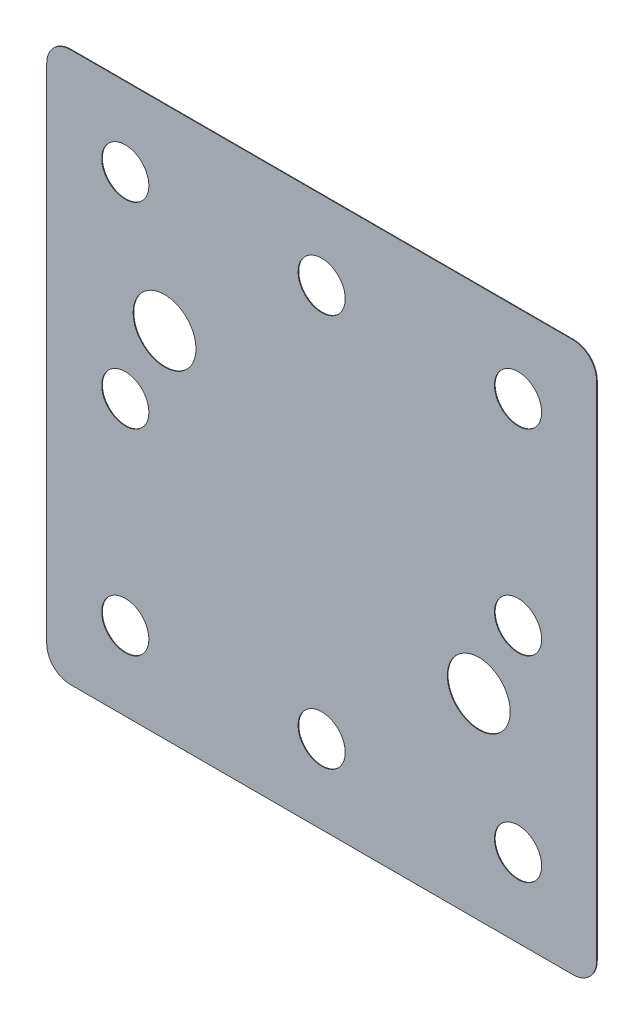
ISO-10303-21;
HEADER;
FILE_DESCRIPTION(('STEP AP214'),'2;1');
FILE_NAME('part.step','',(''),(''),'','','');
FILE_SCHEMA(('AUTOMOTIVE_DESIGN { 1 0 10303 214 1 1 1 1 }'));
ENDSEC;
DATA;
#1=APPLICATION_CONTEXT('core data for automotive mechanical design processes');
#2=APPLICATION_PROTOCOL_DEFINITION('international standard','automotive_design',2000,#1);
#3=PRODUCT_CONTEXT('',#1,'mechanical');
#4=PRODUCT('Part','Part','',(#3));
#5=PRODUCT_RELATED_PRODUCT_CATEGORY('part','',(#4));
#6=PRODUCT_DEFINITION_FORMATION('','',#4);
#7=PRODUCT_DEFINITION_CONTEXT('part definition',#1,'design');
#8=PRODUCT_DEFINITION('design','',#6,#7);
#9=PRODUCT_DEFINITION_SHAPE('','',#8);
#10=(LENGTH_UNIT() NAMED_UNIT(*) SI_UNIT(.MILLI.,.METRE.));
#11=(NAMED_UNIT(*) PLANE_ANGLE_UNIT() SI_UNIT($,.RADIAN.));
#12=(NAMED_UNIT(*) SI_UNIT($,.STERADIAN.) SOLID_ANGLE_UNIT());
#13=UNCERTAINTY_MEASURE_WITH_UNIT(LENGTH_MEASURE(1.E-05),#10,'distance_accuracy_value','');
#14=(GEOMETRIC_REPRESENTATION_CONTEXT(3) GLOBAL_UNCERTAINTY_ASSIGNED_CONTEXT((#13)) GLOBAL_UNIT_ASSIGNED_CONTEXT((#10,
#11,#12)) REPRESENTATION_CONTEXT('',''));
#15=CARTESIAN_POINT('',(0.,0.,0.));
#16=DIRECTION('',(0.,0.,1.));
#17=DIRECTION('',(1.,0.,0.));
#18=AXIS2_PLACEMENT_3D('',#15,#16,#17);
#19=CARTESIAN_POINT('',(35.,-35.,0.08));
#20=DIRECTION('',(-1.,0.,0.));
#21=DIRECTION('',(0.,0.,1.));
#22=AXIS2_PLACEMENT_3D('',#19,#20,#21);
#23=PLANE('',#22);
#24=DIRECTION('',(0.,1.,0.));
#25=VECTOR('',#24,1.);
#26=CARTESIAN_POINT('',(35.,-35.,0.08));
#27=LINE('',#26,#25);
#28=CARTESIAN_POINT('',(35.,-32.,0.08));
#29=VERTEX_POINT('',#28);
#30=CARTESIAN_POINT('',(35.,32.,0.08));
#31=VERTEX_POINT('',#30);
#32=EDGE_CURVE('E125',#29,#31,#27,.T.);
#33=ORIENTED_EDGE('',*,*,#32,.F.);
#34=DIRECTION('',(0.,0.,-1.));
#35=VECTOR('',#34,1.);
#36=CARTESIAN_POINT('',(35.,-32.,0.08));
#37=LINE('',#36,#35);
#38=CARTESIAN_POINT('',(35.,-32.,0.));
#39=VERTEX_POINT('',#38);
#40=EDGE_CURVE('E177',#29,#39,#37,.T.);
#41=ORIENTED_EDGE('',*,*,#40,.T.);
#42=DIRECTION('',(0.,1.,0.));
#43=VECTOR('',#42,1.);
#44=CARTESIAN_POINT('',(35.,-35.,0.));
#45=LINE('',#44,#43);
#46=CARTESIAN_POINT('',(35.,32.,0.));
#47=VERTEX_POINT('',#46);
#48=EDGE_CURVE('E159',#39,#47,#45,.T.);
#49=ORIENTED_EDGE('',*,*,#48,.T.);
#50=DIRECTION('',(0.,0.,-1.));
#51=VECTOR('',#50,1.);
#52=CARTESIAN_POINT('',(35.,32.,0.08));
#53=LINE('',#52,#51);
#54=EDGE_CURVE('E175',#47,#31,#53,.F.);
#55=ORIENTED_EDGE('',*,*,#54,.T.);
#56=EDGE_LOOP('',(#33,#41,#49,#55));
#57=FACE_BOUND('',#56,.T.);
#58=ADVANCED_FACE('F33',(#57),#23,.F.);
#59=CARTESIAN_POINT('',(-35.,35.,0.08));
#60=DIRECTION('',(0.,-1.,0.));
#61=DIRECTION('',(0.,0.,-1.));
#62=AXIS2_PLACEMENT_3D('',#59,#60,#61);
#63=PLANE('',#62);
#64=DIRECTION('',(-1.,0.,0.));
#65=VECTOR('',#64,1.);
#66=CARTESIAN_POINT('',(-35.,35.,0.08));
#67=LINE('',#66,#65);
#68=CARTESIAN_POINT('',(32.,35.,0.08));
#69=VERTEX_POINT('',#68);
#70=CARTESIAN_POINT('',(-32.,35.,0.08));
#71=VERTEX_POINT('',#70);
#72=EDGE_CURVE('E128',#69,#71,#67,.T.);
#73=ORIENTED_EDGE('',*,*,#72,.F.);
#74=DIRECTION('',(0.,0.,-1.));
#75=VECTOR('',#74,1.);
#76=CARTESIAN_POINT('',(32.,35.,0.08));
#77=LINE('',#76,#75);
#78=CARTESIAN_POINT('',(32.,35.,0.));
#79=VERTEX_POINT('',#78);
#80=EDGE_CURVE('E11',#69,#79,#77,.T.);
#81=ORIENTED_EDGE('',*,*,#80,.T.);
#82=DIRECTION('',(-1.,0.,0.));
#83=VECTOR('',#82,1.);
#84=CARTESIAN_POINT('',(-35.,35.,0.));
#85=LINE('',#84,#83);
#86=CARTESIAN_POINT('',(-32.,35.,0.));
#87=VERTEX_POINT('',#86);
#88=EDGE_CURVE('E130',#79,#87,#85,.T.);
#89=ORIENTED_EDGE('',*,*,#88,.T.);
#90=DIRECTION('',(0.,0.,-1.));
#91=VECTOR('',#90,1.);
#92=CARTESIAN_POINT('',(-32.,35.,0.08));
#93=LINE('',#92,#91);
#94=EDGE_CURVE('E41',#87,#71,#93,.F.);
#95=ORIENTED_EDGE('',*,*,#94,.T.);
#96=EDGE_LOOP('',(#73,#81,#89,#95));
#97=FACE_BOUND('',#96,.T.);
#98=ADVANCED_FACE('F271',(#97),#63,.F.);
#99=CARTESIAN_POINT('',(-35.,-35.,0.08));
#100=DIRECTION('',(1.,0.,0.));
#101=DIRECTION('',(0.,0.,-1.));
#102=AXIS2_PLACEMENT_3D('',#99,#100,#101);
#103=PLANE('',#102);
#104=DIRECTION('',(0.,-1.,0.));
#105=VECTOR('',#104,1.);
#106=CARTESIAN_POINT('',(-35.,-35.,0.));
#107=LINE('',#106,#105);
#108=CARTESIAN_POINT('',(-35.,32.,0.));
#109=VERTEX_POINT('',#108);
#110=CARTESIAN_POINT('',(-35.,-32.,0.));
#111=VERTEX_POINT('',#110);
#112=EDGE_CURVE('E126',#109,#111,#107,.T.);
#113=ORIENTED_EDGE('',*,*,#112,.T.);
#114=DIRECTION('',(0.,0.,-1.));
#115=VECTOR('',#114,1.);
#116=CARTESIAN_POINT('',(-35.,-32.,0.08));
#117=LINE('',#116,#115);
#118=CARTESIAN_POINT('',(-35.,-32.,0.08));
#119=VERTEX_POINT('',#118);
#120=EDGE_CURVE('E104',#111,#119,#117,.F.);
#121=ORIENTED_EDGE('',*,*,#120,.T.);
#122=DIRECTION('',(0.,-1.,0.));
#123=VECTOR('',#122,1.);
#124=CARTESIAN_POINT('',(-35.,-35.,0.08));
#125=LINE('',#124,#123);
#126=CARTESIAN_POINT('',(-35.,32.,0.08));
#127=VERTEX_POINT('',#126);
#128=EDGE_CURVE('E190',#127,#119,#125,.T.);
#129=ORIENTED_EDGE('',*,*,#128,.F.);
#130=DIRECTION('',(0.,0.,-1.));
#131=VECTOR('',#130,1.);
#132=CARTESIAN_POINT('',(-35.,32.,0.08));
#133=LINE('',#132,#131);
#134=EDGE_CURVE('E109',#127,#109,#133,.T.);
#135=ORIENTED_EDGE('',*,*,#134,.T.);
#136=EDGE_LOOP('',(#113,#121,#129,#135));
#137=FACE_BOUND('',#136,.T.);
#138=ADVANCED_FACE('F269',(#137),#103,.F.);
#139=CARTESIAN_POINT('',(-35.,-35.,0.08));
#140=DIRECTION('',(0.,1.,0.));
#141=DIRECTION('',(0.,0.,1.));
#142=AXIS2_PLACEMENT_3D('',#139,#140,#141);
#143=PLANE('',#142);
#144=DIRECTION('',(1.,0.,0.));
#145=VECTOR('',#144,1.);
#146=CARTESIAN_POINT('',(-35.,-35.,0.08));
#147=LINE('',#146,#145);
#148=CARTESIAN_POINT('',(-32.,-35.,0.08));
#149=VERTEX_POINT('',#148);
#150=CARTESIAN_POINT('',(32.,-35.,0.08));
#151=VERTEX_POINT('',#150);
#152=EDGE_CURVE('E119',#149,#151,#147,.T.);
#153=ORIENTED_EDGE('',*,*,#152,.F.);
#154=DIRECTION('',(0.,0.,-1.));
#155=VECTOR('',#154,1.);
#156=CARTESIAN_POINT('',(-32.,-35.,0.08));
#157=LINE('',#156,#155);
#158=CARTESIAN_POINT('',(-32.,-35.,0.));
#159=VERTEX_POINT('',#158);
#160=EDGE_CURVE('E103',#149,#159,#157,.T.);
#161=ORIENTED_EDGE('',*,*,#160,.T.);
#162=DIRECTION('',(1.,0.,0.));
#163=VECTOR('',#162,1.);
#164=CARTESIAN_POINT('',(-35.,-35.,0.));
#165=LINE('',#164,#163);
#166=CARTESIAN_POINT('',(32.,-35.,0.));
#167=VERTEX_POINT('',#166);
#168=EDGE_CURVE('E116',#159,#167,#165,.T.);
#169=ORIENTED_EDGE('',*,*,#168,.T.);
#170=DIRECTION('',(0.,0.,-1.));
#171=VECTOR('',#170,1.);
#172=CARTESIAN_POINT('',(32.,-35.,0.08));
#173=LINE('',#172,#171);
#174=EDGE_CURVE('E121',#167,#151,#173,.F.);
#175=ORIENTED_EDGE('',*,*,#174,.T.);
#176=EDGE_LOOP('',(#153,#161,#169,#175));
#177=FACE_BOUND('',#176,.T.);
#178=ADVANCED_FACE('F115',(#177),#143,.F.);
#179=CARTESIAN_POINT('',(0.,0.,0.08));
#180=DIRECTION('',(0.,0.,-1.));
#181=DIRECTION('',(-1.,0.,0.));
#182=AXIS2_PLACEMENT_3D('',#179,#180,#181);
#183=PLANE('',#182);
#184=CARTESIAN_POINT('',(-20.,10.,0.0800000000000002));
#185=DIRECTION('',(0.,0.,-1.));
#186=DIRECTION('',(-1.,0.,0.));
#187=AXIS2_PLACEMENT_3D('',#184,#185,#186);
#188=CIRCLE('',#187,4.);
#189=CARTESIAN_POINT('',(-24.,10.,0.0800000000000002));
#190=VERTEX_POINT('',#189);
#191=EDGE_CURVE('E201',#190,#190,#188,.T.);
#192=ORIENTED_EDGE('',*,*,#191,.T.);
#193=EDGE_LOOP('',(#192));
#194=FACE_BOUND('',#193,.T.);
#195=CARTESIAN_POINT('',(20.,-10.,0.0800000000000002));
#196=DIRECTION('',(0.,0.,-1.));
#197=DIRECTION('',(-1.,0.,0.));
#198=AXIS2_PLACEMENT_3D('',#195,#196,#197);
#199=CIRCLE('',#198,4.);
#200=CARTESIAN_POINT('',(16.,-10.,0.0800000000000002));
#201=VERTEX_POINT('',#200);
#202=EDGE_CURVE('E220',#201,#201,#199,.T.);
#203=ORIENTED_EDGE('',*,*,#202,.T.);
#204=EDGE_LOOP('',(#203));
#205=FACE_BOUND('',#204,.T.);
#206=CARTESIAN_POINT('',(25.,-25.,0.08));
#207=DIRECTION('',(0.,0.,1.));
#208=DIRECTION('',(1.,0.,0.));
#209=AXIS2_PLACEMENT_3D('',#206,#207,#208);
#210=CIRCLE('',#209,3.);
#211=CARTESIAN_POINT('',(28.,-25.,0.08));
#212=VERTEX_POINT('',#211);
#213=EDGE_CURVE('E197',#212,#212,#210,.T.);
#214=ORIENTED_EDGE('',*,*,#213,.F.);
#215=EDGE_LOOP('',(#214));
#216=FACE_BOUND('',#215,.T.);
#217=CARTESIAN_POINT('',(0.,-25.,0.08));
#218=DIRECTION('',(0.,0.,1.));
#219=DIRECTION('',(1.,0.,0.));
#220=AXIS2_PLACEMENT_3D('',#217,#218,#219);
#221=CIRCLE('',#220,3.);
#222=CARTESIAN_POINT('',(3.00000000000001,-25.,0.08));
#223=VERTEX_POINT('',#222);
#224=EDGE_CURVE('E200',#223,#223,#221,.T.);
#225=ORIENTED_EDGE('',*,*,#224,.F.);
#226=EDGE_LOOP('',(#225));
#227=FACE_BOUND('',#226,.T.);
#228=CARTESIAN_POINT('',(-25.,-25.,0.08));
#229=DIRECTION('',(0.,0.,1.));
#230=DIRECTION('',(1.,0.,0.));
#231=AXIS2_PLACEMENT_3D('',#228,#229,#230);
#232=CIRCLE('',#231,3.);
#233=CARTESIAN_POINT('',(-22.,-25.,0.08));
#234=VERTEX_POINT('',#233);
#235=EDGE_CURVE('E204',#234,#234,#232,.T.);
#236=ORIENTED_EDGE('',*,*,#235,.F.);
#237=EDGE_LOOP('',(#236));
#238=FACE_BOUND('',#237,.T.);
#239=CARTESIAN_POINT('',(-25.,25.,0.08));
#240=DIRECTION('',(0.,0.,1.));
#241=DIRECTION('',(1.,0.,0.));
#242=AXIS2_PLACEMENT_3D('',#239,#240,#241);
#243=CIRCLE('',#242,3.);
#244=CARTESIAN_POINT('',(-22.,25.,0.08));
#245=VERTEX_POINT('',#244);
#246=EDGE_CURVE('E207',#245,#245,#243,.T.);
#247=ORIENTED_EDGE('',*,*,#246,.F.);
#248=EDGE_LOOP('',(#247));
#249=FACE_BOUND('',#248,.T.);
#250=CARTESIAN_POINT('',(-25.,0.,0.08));
#251=DIRECTION('',(0.,0.,1.));
#252=DIRECTION('',(1.,0.,0.));
#253=AXIS2_PLACEMENT_3D('',#250,#251,#252);
#254=CIRCLE('',#253,3.);
#255=CARTESIAN_POINT('',(-22.,0.,0.08));
#256=VERTEX_POINT('',#255);
#257=EDGE_CURVE('E210',#256,#256,#254,.T.);
#258=ORIENTED_EDGE('',*,*,#257,.F.);
#259=EDGE_LOOP('',(#258));
#260=FACE_BOUND('',#259,.T.);
#261=CARTESIAN_POINT('',(25.,0.,0.08));
#262=DIRECTION('',(0.,0.,1.));
#263=DIRECTION('',(1.,0.,0.));
#264=AXIS2_PLACEMENT_3D('',#261,#262,#263);
#265=CIRCLE('',#264,3.);
#266=CARTESIAN_POINT('',(28.,0.,0.08));
#267=VERTEX_POINT('',#266);
#268=EDGE_CURVE('E213',#267,#267,#265,.T.);
#269=ORIENTED_EDGE('',*,*,#268,.F.);
#270=EDGE_LOOP('',(#269));
#271=FACE_BOUND('',#270,.T.);
#272=CARTESIAN_POINT('',(25.,25.,0.08));
#273=DIRECTION('',(0.,0.,1.));
#274=DIRECTION('',(1.,0.,0.));
#275=AXIS2_PLACEMENT_3D('',#272,#273,#274);
#276=CIRCLE('',#275,3.);
#277=CARTESIAN_POINT('',(28.,25.,0.08));
#278=VERTEX_POINT('',#277);
#279=EDGE_CURVE('E196',#278,#278,#276,.T.);
#280=ORIENTED_EDGE('',*,*,#279,.F.);
#281=EDGE_LOOP('',(#280));
#282=FACE_BOUND('',#281,.T.);
#283=CARTESIAN_POINT('',(0.,25.,0.08));
#284=DIRECTION('',(0.,0.,1.));
#285=DIRECTION('',(1.,0.,0.));
#286=AXIS2_PLACEMENT_3D('',#283,#284,#285);
#287=CIRCLE('',#286,3.);
#288=CARTESIAN_POINT('',(3.00000000000001,25.,0.08));
#289=VERTEX_POINT('',#288);
#290=EDGE_CURVE('E138',#289,#289,#287,.T.);
#291=ORIENTED_EDGE('',*,*,#290,.F.);
#292=EDGE_LOOP('',(#291));
#293=FACE_BOUND('',#292,.T.);
#294=ORIENTED_EDGE('',*,*,#128,.T.);
#295=CARTESIAN_POINT('',(-32.,-32.,0.08));
#296=DIRECTION('',(0.,0.,-1.));
#297=DIRECTION('',(-1.,0.,0.));
#298=AXIS2_PLACEMENT_3D('',#295,#296,#297);
#299=CIRCLE('',#298,3.);
#300=EDGE_CURVE('E173',#119,#149,#299,.F.);
#301=ORIENTED_EDGE('',*,*,#300,.T.);
#302=ORIENTED_EDGE('',*,*,#152,.T.);
#303=CARTESIAN_POINT('',(32.,-32.,0.08));
#304=DIRECTION('',(0.,0.,-1.));
#305=DIRECTION('',(-1.,0.,0.));
#306=AXIS2_PLACEMENT_3D('',#303,#304,#305);
#307=CIRCLE('',#306,3.);
#308=EDGE_CURVE('E171',#151,#29,#307,.F.);
#309=ORIENTED_EDGE('',*,*,#308,.T.);
#310=ORIENTED_EDGE('',*,*,#32,.T.);
#311=CARTESIAN_POINT('',(32.,32.,0.08));
#312=DIRECTION('',(0.,0.,-1.));
#313=DIRECTION('',(-1.,0.,0.));
#314=AXIS2_PLACEMENT_3D('',#311,#312,#313);
#315=CIRCLE('',#314,3.);
#316=EDGE_CURVE('E54',#31,#69,#315,.F.);
#317=ORIENTED_EDGE('',*,*,#316,.T.);
#318=ORIENTED_EDGE('',*,*,#72,.T.);
#319=CARTESIAN_POINT('',(-32.,32.,0.08));
#320=DIRECTION('',(0.,0.,-1.));
#321=DIRECTION('',(-1.,0.,0.));
#322=AXIS2_PLACEMENT_3D('',#319,#320,#321);
#323=CIRCLE('',#322,3.);
#324=EDGE_CURVE('E168',#71,#127,#323,.F.);
#325=ORIENTED_EDGE('',*,*,#324,.T.);
#326=EDGE_LOOP('',(#294,#301,#302,#309,#310,#317,#318,#325));
#327=FACE_BOUND('',#326,.T.);
#328=ADVANCED_FACE('F236',(#194,#205,#216,#227,#238,#249,#260,#271,#282,#293,#327),#183,.F.);
#329=CARTESIAN_POINT('',(0.,0.,0.));
#330=DIRECTION('',(0.,0.,-1.));
#331=DIRECTION('',(-1.,0.,0.));
#332=AXIS2_PLACEMENT_3D('',#329,#330,#331);
#333=PLANE('',#332);
#334=CARTESIAN_POINT('',(-20.,10.,0.));
#335=DIRECTION('',(0.,0.,-1.));
#336=DIRECTION('',(-1.,0.,0.));
#337=AXIS2_PLACEMENT_3D('',#334,#335,#336);
#338=CIRCLE('',#337,4.);
#339=CARTESIAN_POINT('',(-24.,10.,0.));
#340=VERTEX_POINT('',#339);
#341=EDGE_CURVE('E223',#340,#340,#338,.T.);
#342=ORIENTED_EDGE('',*,*,#341,.F.);
#343=EDGE_LOOP('',(#342));
#344=FACE_BOUND('',#343,.T.);
#345=CARTESIAN_POINT('',(20.,-10.,0.));
#346=DIRECTION('',(0.,0.,-1.));
#347=DIRECTION('',(-1.,0.,0.));
#348=AXIS2_PLACEMENT_3D('',#345,#346,#347);
#349=CIRCLE('',#348,4.);
#350=CARTESIAN_POINT('',(16.,-10.,0.));
#351=VERTEX_POINT('',#350);
#352=EDGE_CURVE('E224',#351,#351,#349,.T.);
#353=ORIENTED_EDGE('',*,*,#352,.F.);
#354=EDGE_LOOP('',(#353));
#355=FACE_BOUND('',#354,.T.);
#356=CARTESIAN_POINT('',(25.,-25.,0.));
#357=DIRECTION('',(0.,0.,-1.));
#358=DIRECTION('',(-1.,0.,0.));
#359=AXIS2_PLACEMENT_3D('',#356,#357,#358);
#360=CIRCLE('',#359,3.);
#361=CARTESIAN_POINT('',(22.,-25.,0.));
#362=VERTEX_POINT('',#361);
#363=EDGE_CURVE('E156',#362,#362,#360,.T.);
#364=ORIENTED_EDGE('',*,*,#363,.F.);
#365=EDGE_LOOP('',(#364));
#366=FACE_BOUND('',#365,.T.);
#367=CARTESIAN_POINT('',(0.,-25.,0.));
#368=DIRECTION('',(0.,0.,-1.));
#369=DIRECTION('',(-1.,0.,0.));
#370=AXIS2_PLACEMENT_3D('',#367,#368,#369);
#371=CIRCLE('',#370,3.);
#372=CARTESIAN_POINT('',(-2.99999999999999,-25.,0.));
#373=VERTEX_POINT('',#372);
#374=EDGE_CURVE('E153',#373,#373,#371,.T.);
#375=ORIENTED_EDGE('',*,*,#374,.F.);
#376=EDGE_LOOP('',(#375));
#377=FACE_BOUND('',#376,.T.);
#378=CARTESIAN_POINT('',(-25.,-25.,0.));
#379=DIRECTION('',(0.,0.,-1.));
#380=DIRECTION('',(-1.,0.,0.));
#381=AXIS2_PLACEMENT_3D('',#378,#379,#380);
#382=CIRCLE('',#381,3.);
#383=CARTESIAN_POINT('',(-28.,-25.,0.));
#384=VERTEX_POINT('',#383);
#385=EDGE_CURVE('E150',#384,#384,#382,.T.);
#386=ORIENTED_EDGE('',*,*,#385,.F.);
#387=EDGE_LOOP('',(#386));
#388=FACE_BOUND('',#387,.T.);
#389=CARTESIAN_POINT('',(-25.,25.,0.));
#390=DIRECTION('',(0.,0.,-1.));
#391=DIRECTION('',(-1.,0.,0.));
#392=AXIS2_PLACEMENT_3D('',#389,#390,#391);
#393=CIRCLE('',#392,3.);
#394=CARTESIAN_POINT('',(-28.,25.,0.));
#395=VERTEX_POINT('',#394);
#396=EDGE_CURVE('E147',#395,#395,#393,.T.);
#397=ORIENTED_EDGE('',*,*,#396,.F.);
#398=EDGE_LOOP('',(#397));
#399=FACE_BOUND('',#398,.T.);
#400=CARTESIAN_POINT('',(-25.,0.,0.));
#401=DIRECTION('',(0.,0.,-1.));
#402=DIRECTION('',(-1.,0.,0.));
#403=AXIS2_PLACEMENT_3D('',#400,#401,#402);
#404=CIRCLE('',#403,3.);
#405=CARTESIAN_POINT('',(-28.,0.,0.));
#406=VERTEX_POINT('',#405);
#407=EDGE_CURVE('E144',#406,#406,#404,.T.);
#408=ORIENTED_EDGE('',*,*,#407,.F.);
#409=EDGE_LOOP('',(#408));
#410=FACE_BOUND('',#409,.T.);
#411=CARTESIAN_POINT('',(25.,0.,0.));
#412=DIRECTION('',(0.,0.,-1.));
#413=DIRECTION('',(-1.,0.,0.));
#414=AXIS2_PLACEMENT_3D('',#411,#412,#413);
#415=CIRCLE('',#414,3.);
#416=CARTESIAN_POINT('',(22.,0.,0.));
#417=VERTEX_POINT('',#416);
#418=EDGE_CURVE('E141',#417,#417,#415,.T.);
#419=ORIENTED_EDGE('',*,*,#418,.F.);
#420=EDGE_LOOP('',(#419));
#421=FACE_BOUND('',#420,.T.);
#422=CARTESIAN_POINT('',(25.,25.,0.));
#423=DIRECTION('',(0.,0.,-1.));
#424=DIRECTION('',(-1.,0.,0.));
#425=AXIS2_PLACEMENT_3D('',#422,#423,#424);
#426=CIRCLE('',#425,3.);
#427=CARTESIAN_POINT('',(22.,25.,0.));
#428=VERTEX_POINT('',#427);
#429=EDGE_CURVE('E137',#428,#428,#426,.T.);
#430=ORIENTED_EDGE('',*,*,#429,.F.);
#431=EDGE_LOOP('',(#430));
#432=FACE_BOUND('',#431,.T.);
#433=CARTESIAN_POINT('',(0.,25.,0.));
#434=DIRECTION('',(0.,0.,-1.));
#435=DIRECTION('',(-1.,0.,0.));
#436=AXIS2_PLACEMENT_3D('',#433,#434,#435);
#437=CIRCLE('',#436,3.);
#438=CARTESIAN_POINT('',(-2.99999999999999,25.,0.));
#439=VERTEX_POINT('',#438);
#440=EDGE_CURVE('E134',#439,#439,#437,.T.);
#441=ORIENTED_EDGE('',*,*,#440,.F.);
#442=EDGE_LOOP('',(#441));
#443=FACE_BOUND('',#442,.T.);
#444=ORIENTED_EDGE('',*,*,#168,.F.);
#445=CARTESIAN_POINT('',(-32.,-32.,0.));
#446=DIRECTION('',(0.,0.,-1.));
#447=DIRECTION('',(-1.,0.,0.));
#448=AXIS2_PLACEMENT_3D('',#445,#446,#447);
#449=CIRCLE('',#448,3.);
#450=EDGE_CURVE('E99',#159,#111,#449,.T.);
#451=ORIENTED_EDGE('',*,*,#450,.T.);
#452=ORIENTED_EDGE('',*,*,#112,.F.);
#453=CARTESIAN_POINT('',(-32.,32.,0.));
#454=DIRECTION('',(0.,0.,-1.));
#455=DIRECTION('',(-1.,0.,0.));
#456=AXIS2_PLACEMENT_3D('',#453,#454,#455);
#457=CIRCLE('',#456,3.);
#458=EDGE_CURVE('E120',#109,#87,#457,.T.);
#459=ORIENTED_EDGE('',*,*,#458,.T.);
#460=ORIENTED_EDGE('',*,*,#88,.F.);
#461=CARTESIAN_POINT('',(32.,32.,0.));
#462=DIRECTION('',(0.,0.,-1.));
#463=DIRECTION('',(-1.,0.,0.));
#464=AXIS2_PLACEMENT_3D('',#461,#462,#463);
#465=CIRCLE('',#464,3.);
#466=EDGE_CURVE('E162',#79,#47,#465,.T.);
#467=ORIENTED_EDGE('',*,*,#466,.T.);
#468=ORIENTED_EDGE('',*,*,#48,.F.);
#469=CARTESIAN_POINT('',(32.,-32.,0.));
#470=DIRECTION('',(0.,0.,-1.));
#471=DIRECTION('',(-1.,0.,0.));
#472=AXIS2_PLACEMENT_3D('',#469,#470,#471);
#473=CIRCLE('',#472,3.);
#474=EDGE_CURVE('E110',#39,#167,#473,.T.);
#475=ORIENTED_EDGE('',*,*,#474,.T.);
#476=EDGE_LOOP('',(#444,#451,#452,#459,#460,#467,#468,#475));
#477=FACE_BOUND('',#476,.T.);
#478=ADVANCED_FACE('F123',(#344,#355,#366,#377,#388,#399,#410,#421,#432,#443,#477),#333,.T.);
#479=CARTESIAN_POINT('',(0.,25.,-9.92));
#480=DIRECTION('',(0.,0.,1.));
#481=DIRECTION('',(1.,0.,0.));
#482=AXIS2_PLACEMENT_3D('',#479,#480,#481);
#483=CYLINDRICAL_SURFACE('',#482,3.);
#484=ORIENTED_EDGE('',*,*,#440,.T.);
#485=EDGE_LOOP('',(#484));
#486=FACE_BOUND('',#485,.T.);
#487=ORIENTED_EDGE('',*,*,#290,.T.);
#488=EDGE_LOOP('',(#487));
#489=FACE_BOUND('',#488,.T.);
#490=ADVANCED_FACE('F235',(#486,#489),#483,.F.);
#491=CARTESIAN_POINT('',(25.,25.,-9.92));
#492=DIRECTION('',(0.,0.,1.));
#493=DIRECTION('',(1.,0.,0.));
#494=AXIS2_PLACEMENT_3D('',#491,#492,#493);
#495=CYLINDRICAL_SURFACE('',#494,3.);
#496=ORIENTED_EDGE('',*,*,#429,.T.);
#497=EDGE_LOOP('',(#496));
#498=FACE_BOUND('',#497,.T.);
#499=ORIENTED_EDGE('',*,*,#279,.T.);
#500=EDGE_LOOP('',(#499));
#501=FACE_BOUND('',#500,.T.);
#502=ADVANCED_FACE('F258',(#498,#501),#495,.F.);
#503=CARTESIAN_POINT('',(25.,0.,-9.92));
#504=DIRECTION('',(0.,0.,1.));
#505=DIRECTION('',(1.,0.,0.));
#506=AXIS2_PLACEMENT_3D('',#503,#504,#505);
#507=CYLINDRICAL_SURFACE('',#506,3.);
#508=ORIENTED_EDGE('',*,*,#418,.T.);
#509=EDGE_LOOP('',(#508));
#510=FACE_BOUND('',#509,.T.);
#511=ORIENTED_EDGE('',*,*,#268,.T.);
#512=EDGE_LOOP('',(#511));
#513=FACE_BOUND('',#512,.T.);
#514=ADVANCED_FACE('F313',(#510,#513),#507,.F.);
#515=CARTESIAN_POINT('',(-25.,0.,-9.92));
#516=DIRECTION('',(0.,0.,1.));
#517=DIRECTION('',(1.,0.,0.));
#518=AXIS2_PLACEMENT_3D('',#515,#516,#517);
#519=CYLINDRICAL_SURFACE('',#518,3.);
#520=ORIENTED_EDGE('',*,*,#407,.T.);
#521=EDGE_LOOP('',(#520));
#522=FACE_BOUND('',#521,.T.);
#523=ORIENTED_EDGE('',*,*,#257,.T.);
#524=EDGE_LOOP('',(#523));
#525=FACE_BOUND('',#524,.T.);
#526=ADVANCED_FACE('F309',(#522,#525),#519,.F.);
#527=CARTESIAN_POINT('',(-25.,25.,-9.92));
#528=DIRECTION('',(0.,0.,1.));
#529=DIRECTION('',(1.,0.,0.));
#530=AXIS2_PLACEMENT_3D('',#527,#528,#529);
#531=CYLINDRICAL_SURFACE('',#530,3.);
#532=ORIENTED_EDGE('',*,*,#396,.T.);
#533=EDGE_LOOP('',(#532));
#534=FACE_BOUND('',#533,.T.);
#535=ORIENTED_EDGE('',*,*,#246,.T.);
#536=EDGE_LOOP('',(#535));
#537=FACE_BOUND('',#536,.T.);
#538=ADVANCED_FACE('F305',(#534,#537),#531,.F.);
#539=CARTESIAN_POINT('',(-25.,-25.,-9.92));
#540=DIRECTION('',(0.,0.,1.));
#541=DIRECTION('',(1.,0.,0.));
#542=AXIS2_PLACEMENT_3D('',#539,#540,#541);
#543=CYLINDRICAL_SURFACE('',#542,3.);
#544=ORIENTED_EDGE('',*,*,#385,.T.);
#545=EDGE_LOOP('',(#544));
#546=FACE_BOUND('',#545,.T.);
#547=ORIENTED_EDGE('',*,*,#235,.T.);
#548=EDGE_LOOP('',(#547));
#549=FACE_BOUND('',#548,.T.);
#550=ADVANCED_FACE('F301',(#546,#549),#543,.F.);
#551=CARTESIAN_POINT('',(0.,-25.,-9.92));
#552=DIRECTION('',(0.,0.,1.));
#553=DIRECTION('',(1.,0.,0.));
#554=AXIS2_PLACEMENT_3D('',#551,#552,#553);
#555=CYLINDRICAL_SURFACE('',#554,3.);
#556=ORIENTED_EDGE('',*,*,#374,.T.);
#557=EDGE_LOOP('',(#556));
#558=FACE_BOUND('',#557,.T.);
#559=ORIENTED_EDGE('',*,*,#224,.T.);
#560=EDGE_LOOP('',(#559));
#561=FACE_BOUND('',#560,.T.);
#562=ADVANCED_FACE('F297',(#558,#561),#555,.F.);
#563=CARTESIAN_POINT('',(25.,-25.,-9.92));
#564=DIRECTION('',(0.,0.,1.));
#565=DIRECTION('',(1.,0.,0.));
#566=AXIS2_PLACEMENT_3D('',#563,#564,#565);
#567=CYLINDRICAL_SURFACE('',#566,3.);
#568=ORIENTED_EDGE('',*,*,#363,.T.);
#569=EDGE_LOOP('',(#568));
#570=FACE_BOUND('',#569,.T.);
#571=ORIENTED_EDGE('',*,*,#213,.T.);
#572=EDGE_LOOP('',(#571));
#573=FACE_BOUND('',#572,.T.);
#574=ADVANCED_FACE('F282',(#570,#573),#567,.F.);
#575=CARTESIAN_POINT('',(-32.,-32.,0.08));
#576=DIRECTION('',(0.,0.,-1.));
#577=DIRECTION('',(-1.,0.,0.));
#578=AXIS2_PLACEMENT_3D('',#575,#576,#577);
#579=CYLINDRICAL_SURFACE('',#578,3.);
#580=ORIENTED_EDGE('',*,*,#300,.F.);
#581=ORIENTED_EDGE('',*,*,#120,.F.);
#582=ORIENTED_EDGE('',*,*,#450,.F.);
#583=ORIENTED_EDGE('',*,*,#160,.F.);
#584=EDGE_LOOP('',(#580,#581,#582,#583));
#585=FACE_BOUND('',#584,.T.);
#586=ADVANCED_FACE('F102',(#585),#579,.T.);
#587=CARTESIAN_POINT('',(32.,-32.,0.08));
#588=DIRECTION('',(0.,0.,-1.));
#589=DIRECTION('',(-1.,0.,0.));
#590=AXIS2_PLACEMENT_3D('',#587,#588,#589);
#591=CYLINDRICAL_SURFACE('',#590,3.);
#592=ORIENTED_EDGE('',*,*,#308,.F.);
#593=ORIENTED_EDGE('',*,*,#174,.F.);
#594=ORIENTED_EDGE('',*,*,#474,.F.);
#595=ORIENTED_EDGE('',*,*,#40,.F.);
#596=EDGE_LOOP('',(#592,#593,#594,#595));
#597=FACE_BOUND('',#596,.T.);
#598=ADVANCED_FACE('F275',(#597),#591,.T.);
#599=CARTESIAN_POINT('',(32.,32.,0.08));
#600=DIRECTION('',(0.,0.,-1.));
#601=DIRECTION('',(-1.,0.,0.));
#602=AXIS2_PLACEMENT_3D('',#599,#600,#601);
#603=CYLINDRICAL_SURFACE('',#602,3.);
#604=ORIENTED_EDGE('',*,*,#316,.F.);
#605=ORIENTED_EDGE('',*,*,#54,.F.);
#606=ORIENTED_EDGE('',*,*,#466,.F.);
#607=ORIENTED_EDGE('',*,*,#80,.F.);
#608=EDGE_LOOP('',(#604,#605,#606,#607));
#609=FACE_BOUND('',#608,.T.);
#610=ADVANCED_FACE('F274',(#609),#603,.T.);
#611=CARTESIAN_POINT('',(-32.,32.,0.08));
#612=DIRECTION('',(0.,0.,-1.));
#613=DIRECTION('',(-1.,0.,0.));
#614=AXIS2_PLACEMENT_3D('',#611,#612,#613);
#615=CYLINDRICAL_SURFACE('',#614,3.);
#616=ORIENTED_EDGE('',*,*,#324,.F.);
#617=ORIENTED_EDGE('',*,*,#94,.F.);
#618=ORIENTED_EDGE('',*,*,#458,.F.);
#619=ORIENTED_EDGE('',*,*,#134,.F.);
#620=EDGE_LOOP('',(#616,#617,#618,#619));
#621=FACE_BOUND('',#620,.T.);
#622=ADVANCED_FACE('F35',(#621),#615,.T.);
#623=CARTESIAN_POINT('',(20.,-10.,10.));
#624=DIRECTION('',(0.,0.,-1.));
#625=DIRECTION('',(-1.,0.,0.));
#626=AXIS2_PLACEMENT_3D('',#623,#624,#625);
#627=CYLINDRICAL_SURFACE('',#626,4.);
#628=ORIENTED_EDGE('',*,*,#352,.T.);
#629=EDGE_LOOP('',(#628));
#630=FACE_BOUND('',#629,.T.);
#631=ORIENTED_EDGE('',*,*,#202,.F.);
#632=EDGE_LOOP('',(#631));
#633=FACE_BOUND('',#632,.T.);
#634=ADVANCED_FACE('F321',(#630,#633),#627,.F.);
#635=CARTESIAN_POINT('',(-20.,10.,10.));
#636=DIRECTION('',(0.,0.,-1.));
#637=DIRECTION('',(-1.,0.,0.));
#638=AXIS2_PLACEMENT_3D('',#635,#636,#637);
#639=CYLINDRICAL_SURFACE('',#638,4.);
#640=ORIENTED_EDGE('',*,*,#341,.T.);
#641=EDGE_LOOP('',(#640));
#642=FACE_BOUND('',#641,.T.);
#643=ORIENTED_EDGE('',*,*,#191,.F.);
#644=EDGE_LOOP('',(#643));
#645=FACE_BOUND('',#644,.T.);
#646=ADVANCED_FACE('F230',(#642,#645),#639,.F.);
#647=CLOSED_SHELL('',(#58,#98,#138,#178,#328,#478,#490,#502,#514,#526,#538,#550,#562,#574,#586,
#598,#610,#622,#634,#646));
#648=MANIFOLD_SOLID_BREP('B2',#647);
#649=ADVANCED_BREP_SHAPE_REPRESENTATION('',(#18,#648),#14);
#650=SHAPE_DEFINITION_REPRESENTATION(#9,#649);
ENDSEC;
END-ISO-10303-21;
